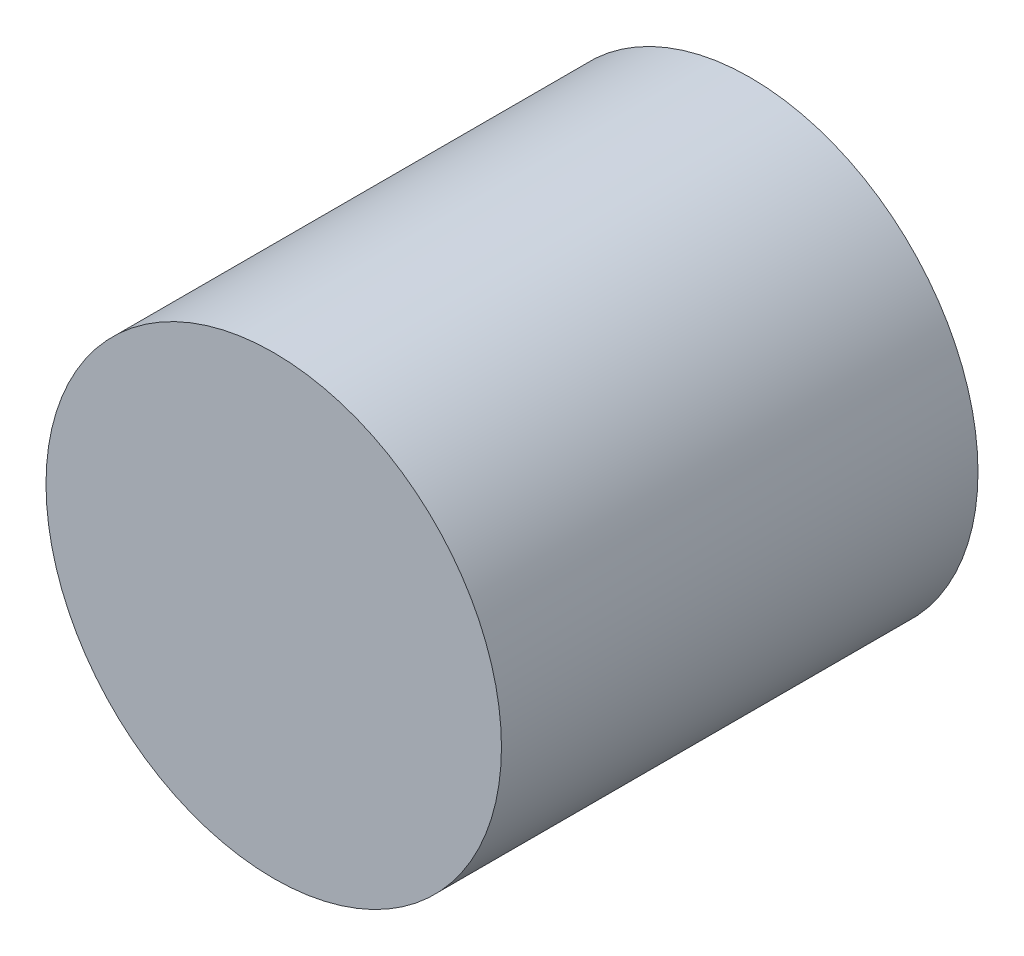
ISO-10303-21;
HEADER;
FILE_DESCRIPTION(('STEP AP214'),'2;1');
FILE_NAME('part.step','',(''),(''),'','','');
FILE_SCHEMA(('AUTOMOTIVE_DESIGN { 1 0 10303 214 1 1 1 1 }'));
ENDSEC;
DATA;
#1=APPLICATION_CONTEXT('core data for automotive mechanical design processes');
#2=APPLICATION_PROTOCOL_DEFINITION('international standard','automotive_design',2000,#1);
#3=PRODUCT_CONTEXT('',#1,'mechanical');
#4=PRODUCT('Part','Part','',(#3));
#5=PRODUCT_RELATED_PRODUCT_CATEGORY('part','',(#4));
#6=PRODUCT_DEFINITION_FORMATION('','',#4);
#7=PRODUCT_DEFINITION_CONTEXT('part definition',#1,'design');
#8=PRODUCT_DEFINITION('design','',#6,#7);
#9=PRODUCT_DEFINITION_SHAPE('','',#8);
#10=(LENGTH_UNIT() NAMED_UNIT(*) SI_UNIT(.MILLI.,.METRE.));
#11=(NAMED_UNIT(*) PLANE_ANGLE_UNIT() SI_UNIT($,.RADIAN.));
#12=(NAMED_UNIT(*) SI_UNIT($,.STERADIAN.) SOLID_ANGLE_UNIT());
#13=UNCERTAINTY_MEASURE_WITH_UNIT(LENGTH_MEASURE(1.E-05),#10,'distance_accuracy_value','');
#14=(GEOMETRIC_REPRESENTATION_CONTEXT(3) GLOBAL_UNCERTAINTY_ASSIGNED_CONTEXT((#13)) GLOBAL_UNIT_ASSIGNED_CONTEXT((#10,
#11,#12)) REPRESENTATION_CONTEXT('',''));
#15=CARTESIAN_POINT('',(0.,0.,0.));
#16=DIRECTION('',(0.,0.,1.));
#17=DIRECTION('',(1.,0.,0.));
#18=AXIS2_PLACEMENT_3D('',#15,#16,#17);
#19=CARTESIAN_POINT('',(0.,0.,-103.632));
#20=DIRECTION('',(0.,0.,1.));
#21=DIRECTION('',(1.,0.,0.));
#22=AXIS2_PLACEMENT_3D('',#19,#20,#21);
#23=CYLINDRICAL_SURFACE('',#22,49.5233612736191);
#24=CARTESIAN_POINT('',(0.,0.,-103.632));
#25=DIRECTION('',(0.,0.,1.));
#26=DIRECTION('',(1.,0.,0.));
#27=AXIS2_PLACEMENT_3D('',#24,#25,#26);
#28=CIRCLE('',#27,49.5233612736191);
#29=CARTESIAN_POINT('',(49.5233612736191,0.,-103.632));
#30=VERTEX_POINT('',#29);
#31=EDGE_CURVE('E10',#30,#30,#28,.T.);
#32=ORIENTED_EDGE('',*,*,#31,.T.);
#33=EDGE_LOOP('',(#32));
#34=FACE_BOUND('',#33,.T.);
#35=CARTESIAN_POINT('',(0.,0.,0.));
#36=DIRECTION('',(0.,0.,1.));
#37=DIRECTION('',(1.,0.,0.));
#38=AXIS2_PLACEMENT_3D('',#35,#36,#37);
#39=CIRCLE('',#38,49.5233612736191);
#40=CARTESIAN_POINT('',(49.5233612736191,0.,0.));
#41=VERTEX_POINT('',#40);
#42=EDGE_CURVE('E40',#41,#41,#39,.T.);
#43=ORIENTED_EDGE('',*,*,#42,.F.);
#44=EDGE_LOOP('',(#43));
#45=FACE_BOUND('',#44,.T.);
#46=ADVANCED_FACE('F37',(#34,#45),#23,.T.);
#47=CARTESIAN_POINT('',(0.,0.,-103.632));
#48=DIRECTION('',(0.,0.,1.));
#49=DIRECTION('',(1.,0.,0.));
#50=AXIS2_PLACEMENT_3D('',#47,#48,#49);
#51=PLANE('',#50);
#52=ORIENTED_EDGE('',*,*,#31,.F.);
#53=EDGE_LOOP('',(#52));
#54=FACE_BOUND('',#53,.T.);
#55=ADVANCED_FACE('F54',(#54),#51,.F.);
#56=CARTESIAN_POINT('',(0.,0.,0.));
#57=DIRECTION('',(0.,0.,1.));
#58=DIRECTION('',(1.,0.,0.));
#59=AXIS2_PLACEMENT_3D('',#56,#57,#58);
#60=PLANE('',#59);
#61=ORIENTED_EDGE('',*,*,#42,.T.);
#62=EDGE_LOOP('',(#61));
#63=FACE_BOUND('',#62,.T.);
#64=ADVANCED_FACE('F51',(#63),#60,.T.);
#65=CLOSED_SHELL('',(#46,#55,#64));
#66=MANIFOLD_SOLID_BREP('B2',#65);
#67=ADVANCED_BREP_SHAPE_REPRESENTATION('',(#18,#66),#14);
#68=SHAPE_DEFINITION_REPRESENTATION(#9,#67);
ENDSEC;
END-ISO-10303-21;
